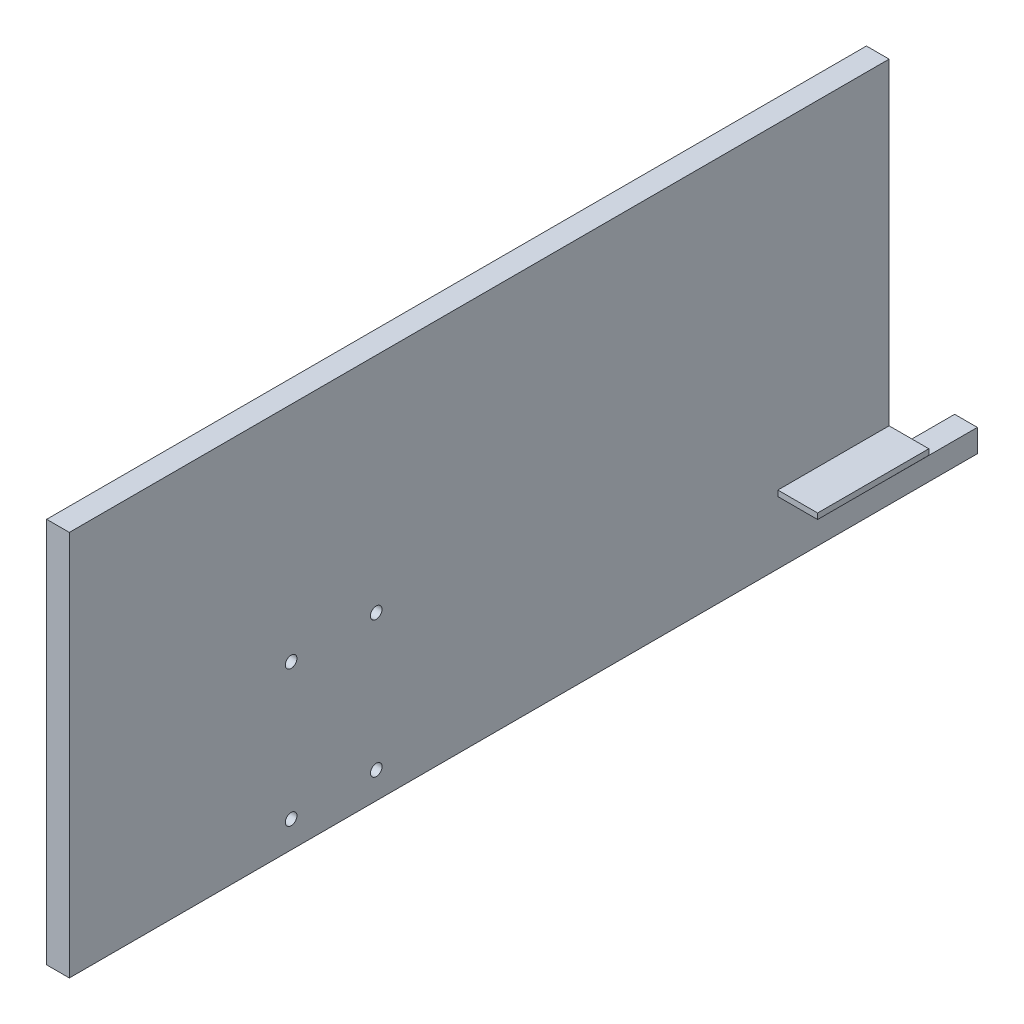
ISO-10303-21;
HEADER;
FILE_DESCRIPTION(('STEP AP214'),'2;1');
FILE_NAME('part.step','',(''),(''),'','','');
FILE_SCHEMA(('AUTOMOTIVE_DESIGN { 1 0 10303 214 1 1 1 1 }'));
ENDSEC;
DATA;
#1=APPLICATION_CONTEXT('core data for automotive mechanical design processes');
#2=APPLICATION_PROTOCOL_DEFINITION('international standard','automotive_design',2000,#1);
#3=PRODUCT_CONTEXT('',#1,'mechanical');
#4=PRODUCT('Part','Part','',(#3));
#5=PRODUCT_RELATED_PRODUCT_CATEGORY('part','',(#4));
#6=PRODUCT_DEFINITION_FORMATION('','',#4);
#7=PRODUCT_DEFINITION_CONTEXT('part definition',#1,'design');
#8=PRODUCT_DEFINITION('design','',#6,#7);
#9=PRODUCT_DEFINITION_SHAPE('','',#8);
#10=(LENGTH_UNIT() NAMED_UNIT(*) SI_UNIT(.MILLI.,.METRE.));
#11=(NAMED_UNIT(*) PLANE_ANGLE_UNIT() SI_UNIT($,.RADIAN.));
#12=(NAMED_UNIT(*) SI_UNIT($,.STERADIAN.) SOLID_ANGLE_UNIT());
#13=UNCERTAINTY_MEASURE_WITH_UNIT(LENGTH_MEASURE(1.E-05),#10,'distance_accuracy_value','');
#14=(GEOMETRIC_REPRESENTATION_CONTEXT(3) GLOBAL_UNCERTAINTY_ASSIGNED_CONTEXT((#13)) GLOBAL_UNIT_ASSIGNED_CONTEXT((#10,
#11,#12)) REPRESENTATION_CONTEXT('',''));
#15=CARTESIAN_POINT('',(0.,0.,0.));
#16=DIRECTION('',(0.,0.,1.));
#17=DIRECTION('',(1.,0.,0.));
#18=AXIS2_PLACEMENT_3D('',#15,#16,#17);
#19=CARTESIAN_POINT('',(10.,-170.,800.));
#20=DIRECTION('',(-1.,0.,0.));
#21=DIRECTION('',(0.,0.,1.));
#22=AXIS2_PLACEMENT_3D('',#19,#20,#21);
#23=PLANE('',#22);
#24=CARTESIAN_POINT('',(10.,-26.4213562373095,604.599389893775));
#25=DIRECTION('',(1.,0.,0.));
#26=DIRECTION('',(0.,0.,-1.));
#27=AXIS2_PLACEMENT_3D('',#24,#25,#26);
#28=CIRCLE('',#27,5.1);
#29=CARTESIAN_POINT('',(10.,-26.4213562373095,599.499389893775));
#30=VERTEX_POINT('',#29);
#31=EDGE_CURVE('E194',#30,#30,#28,.T.);
#32=ORIENTED_EDGE('',*,*,#31,.F.);
#33=EDGE_LOOP('',(#32));
#34=FACE_BOUND('',#33,.T.);
#35=CARTESIAN_POINT('',(10.,-146.42135623731,604.599389893775));
#36=DIRECTION('',(1.,0.,0.));
#37=DIRECTION('',(0.,0.,-1.));
#38=AXIS2_PLACEMENT_3D('',#35,#36,#37);
#39=CIRCLE('',#38,5.09999999999999);
#40=CARTESIAN_POINT('',(10.,-146.42135623731,599.499389893775));
#41=VERTEX_POINT('',#40);
#42=EDGE_CURVE('E188',#41,#41,#39,.T.);
#43=ORIENTED_EDGE('',*,*,#42,.F.);
#44=EDGE_LOOP('',(#43));
#45=FACE_BOUND('',#44,.T.);
#46=CARTESIAN_POINT('',(10.,-146.42135623731,529.599389893775));
#47=DIRECTION('',(1.,0.,0.));
#48=DIRECTION('',(0.,0.,-1.));
#49=AXIS2_PLACEMENT_3D('',#46,#47,#48);
#50=CIRCLE('',#49,5.09999999999999);
#51=CARTESIAN_POINT('',(10.,-146.42135623731,524.499389893775));
#52=VERTEX_POINT('',#51);
#53=EDGE_CURVE('E182',#52,#52,#50,.T.);
#54=ORIENTED_EDGE('',*,*,#53,.F.);
#55=EDGE_LOOP('',(#54));
#56=FACE_BOUND('',#55,.T.);
#57=CARTESIAN_POINT('',(10.,-26.4213562373095,529.599389893775));
#58=DIRECTION('',(1.,0.,0.));
#59=DIRECTION('',(0.,0.,-1.));
#60=AXIS2_PLACEMENT_3D('',#57,#58,#59);
#61=CIRCLE('',#60,5.1);
#62=CARTESIAN_POINT('',(10.,-26.4213562373095,524.499389893775));
#63=VERTEX_POINT('',#62);
#64=EDGE_CURVE('E171',#63,#63,#61,.T.);
#65=ORIENTED_EDGE('',*,*,#64,.F.);
#66=EDGE_LOOP('',(#65));
#67=FACE_BOUND('',#66,.T.);
#68=DIRECTION('',(0.,0.,-1.));
#69=VECTOR('',#68,1.);
#70=CARTESIAN_POINT('',(10.,-114.8,77.7500000000014));
#71=LINE('',#70,#69);
#72=CARTESIAN_POINT('',(10.,-114.8,175.750000000001));
#73=VERTEX_POINT('',#72);
#74=CARTESIAN_POINT('',(10.,-114.8,77.7500000000014));
#75=VERTEX_POINT('',#74);
#76=EDGE_CURVE('E57',#73,#75,#71,.T.);
#77=ORIENTED_EDGE('',*,*,#76,.F.);
#78=DIRECTION('',(0.,-1.,0.));
#79=VECTOR('',#78,1.);
#80=CARTESIAN_POINT('',(10.,-114.8,175.750000000001));
#81=LINE('',#80,#79);
#82=CARTESIAN_POINT('',(10.,-109.8,175.750000000001));
#83=VERTEX_POINT('',#82);
#84=EDGE_CURVE('E233',#83,#73,#81,.T.);
#85=ORIENTED_EDGE('',*,*,#84,.F.);
#86=DIRECTION('',(0.,0.,1.));
#87=VECTOR('',#86,1.);
#88=CARTESIAN_POINT('',(10.,-109.8,77.7500000000014));
#89=LINE('',#88,#87);
#90=CARTESIAN_POINT('',(10.,-109.8,77.7500000000014));
#91=VERTEX_POINT('',#90);
#92=EDGE_CURVE('E232',#91,#83,#89,.T.);
#93=ORIENTED_EDGE('',*,*,#92,.F.);
#94=DIRECTION('',(0.,-1.,0.));
#95=VECTOR('',#94,1.);
#96=CARTESIAN_POINT('',(10.,-149.875,77.7500000000014));
#97=LINE('',#96,#95);
#98=CARTESIAN_POINT('',(10.,170.,77.7500000000014));
#99=VERTEX_POINT('',#98);
#100=EDGE_CURVE('E153',#99,#91,#97,.T.);
#101=ORIENTED_EDGE('',*,*,#100,.F.);
#102=DIRECTION('',(0.,0.,-1.));
#103=VECTOR('',#102,1.);
#104=CARTESIAN_POINT('',(10.,170.,800.));
#105=LINE('',#104,#103);
#106=CARTESIAN_POINT('',(10.,170.,800.));
#107=VERTEX_POINT('',#106);
#108=EDGE_CURVE('E11',#107,#99,#105,.T.);
#109=ORIENTED_EDGE('',*,*,#108,.F.);
#110=DIRECTION('',(0.,1.,0.));
#111=VECTOR('',#110,1.);
#112=CARTESIAN_POINT('',(10.,-170.,800.));
#113=LINE('',#112,#111);
#114=CARTESIAN_POINT('',(10.,-170.,800.));
#115=VERTEX_POINT('',#114);
#116=EDGE_CURVE('E201',#115,#107,#113,.T.);
#117=ORIENTED_EDGE('',*,*,#116,.F.);
#118=DIRECTION('',(0.,0.,-1.));
#119=VECTOR('',#118,1.);
#120=CARTESIAN_POINT('',(10.,-170.,800.));
#121=LINE('',#120,#119);
#122=CARTESIAN_POINT('',(10.,-170.,0.));
#123=VERTEX_POINT('',#122);
#124=EDGE_CURVE('E211',#115,#123,#121,.T.);
#125=ORIENTED_EDGE('',*,*,#124,.T.);
#126=DIRECTION('',(0.,1.,0.));
#127=VECTOR('',#126,1.);
#128=CARTESIAN_POINT('',(10.,-170.,0.));
#129=LINE('',#128,#127);
#130=CARTESIAN_POINT('',(10.,-149.875,0.));
#131=VERTEX_POINT('',#130);
#132=EDGE_CURVE('E200',#123,#131,#129,.T.);
#133=ORIENTED_EDGE('',*,*,#132,.T.);
#134=DIRECTION('',(0.,0.,-1.));
#135=VECTOR('',#134,1.);
#136=CARTESIAN_POINT('',(10.,-149.875,77.7500000000014));
#137=LINE('',#136,#135);
#138=CARTESIAN_POINT('',(10.,-149.875,77.7500000000014));
#139=VERTEX_POINT('',#138);
#140=EDGE_CURVE('E164',#139,#131,#137,.T.);
#141=ORIENTED_EDGE('',*,*,#140,.F.);
#142=EDGE_CURVE('E62',#75,#139,#97,.T.);
#143=ORIENTED_EDGE('',*,*,#142,.F.);
#144=EDGE_LOOP('',(#77,#85,#93,#101,#109,#117,#125,#133,#141,#143));
#145=FACE_BOUND('',#144,.T.);
#146=ADVANCED_FACE('F43',(#34,#45,#56,#67,#145),#23,.F.);
#147=CARTESIAN_POINT('',(-10.,170.,800.));
#148=DIRECTION('',(0.,-1.,0.));
#149=DIRECTION('',(0.,0.,-1.));
#150=AXIS2_PLACEMENT_3D('',#147,#148,#149);
#151=PLANE('',#150);
#152=ORIENTED_EDGE('',*,*,#108,.T.);
#153=DIRECTION('',(1.,0.,0.));
#154=VECTOR('',#153,1.);
#155=CARTESIAN_POINT('',(-10.,170.,77.7500000000014));
#156=LINE('',#155,#154);
#157=CARTESIAN_POINT('',(-10.,170.,77.7500000000014));
#158=VERTEX_POINT('',#157);
#159=EDGE_CURVE('E169',#158,#99,#156,.T.);
#160=ORIENTED_EDGE('',*,*,#159,.F.);
#161=DIRECTION('',(0.,0.,-1.));
#162=VECTOR('',#161,1.);
#163=CARTESIAN_POINT('',(-10.,170.,800.));
#164=LINE('',#163,#162);
#165=CARTESIAN_POINT('',(-10.,170.,800.));
#166=VERTEX_POINT('',#165);
#167=EDGE_CURVE('E50',#166,#158,#164,.T.);
#168=ORIENTED_EDGE('',*,*,#167,.F.);
#169=DIRECTION('',(-1.,0.,0.));
#170=VECTOR('',#169,1.);
#171=CARTESIAN_POINT('',(-10.,170.,800.));
#172=LINE('',#171,#170);
#173=EDGE_CURVE('E204',#107,#166,#172,.T.);
#174=ORIENTED_EDGE('',*,*,#173,.F.);
#175=EDGE_LOOP('',(#152,#160,#168,#174));
#176=FACE_BOUND('',#175,.T.);
#177=ADVANCED_FACE('F229',(#176),#151,.F.);
#178=CARTESIAN_POINT('',(-10.,-170.,800.));
#179=DIRECTION('',(1.,0.,0.));
#180=DIRECTION('',(0.,0.,-1.));
#181=AXIS2_PLACEMENT_3D('',#178,#179,#180);
#182=PLANE('',#181);
#183=ORIENTED_EDGE('',*,*,#167,.T.);
#184=DIRECTION('',(0.,-1.,0.));
#185=VECTOR('',#184,1.);
#186=CARTESIAN_POINT('',(-10.,-149.875,77.7500000000014));
#187=LINE('',#186,#185);
#188=CARTESIAN_POINT('',(-10.,-149.875,77.7500000000014));
#189=VERTEX_POINT('',#188);
#190=EDGE_CURVE('E160',#158,#189,#187,.T.);
#191=ORIENTED_EDGE('',*,*,#190,.T.);
#192=DIRECTION('',(0.,0.,-1.));
#193=VECTOR('',#192,1.);
#194=CARTESIAN_POINT('',(-10.,-149.875,77.7500000000014));
#195=LINE('',#194,#193);
#196=CARTESIAN_POINT('',(-10.,-149.875,0.));
#197=VERTEX_POINT('',#196);
#198=EDGE_CURVE('E163',#189,#197,#195,.T.);
#199=ORIENTED_EDGE('',*,*,#198,.T.);
#200=DIRECTION('',(0.,-1.,0.));
#201=VECTOR('',#200,1.);
#202=CARTESIAN_POINT('',(-10.,-170.,0.));
#203=LINE('',#202,#201);
#204=CARTESIAN_POINT('',(-10.,-170.,0.));
#205=VERTEX_POINT('',#204);
#206=EDGE_CURVE('E214',#197,#205,#203,.T.);
#207=ORIENTED_EDGE('',*,*,#206,.T.);
#208=DIRECTION('',(0.,0.,-1.));
#209=VECTOR('',#208,1.);
#210=CARTESIAN_POINT('',(-10.,-170.,800.));
#211=LINE('',#210,#209);
#212=CARTESIAN_POINT('',(-10.,-170.,800.));
#213=VERTEX_POINT('',#212);
#214=EDGE_CURVE('E219',#213,#205,#211,.T.);
#215=ORIENTED_EDGE('',*,*,#214,.F.);
#216=DIRECTION('',(0.,-1.,0.));
#217=VECTOR('',#216,1.);
#218=CARTESIAN_POINT('',(-10.,-170.,800.));
#219=LINE('',#218,#217);
#220=EDGE_CURVE('E207',#166,#213,#219,.T.);
#221=ORIENTED_EDGE('',*,*,#220,.F.);
#222=EDGE_LOOP('',(#183,#191,#199,#207,#215,#221));
#223=FACE_BOUND('',#222,.T.);
#224=ADVANCED_FACE('F225',(#223),#182,.F.);
#225=CARTESIAN_POINT('',(-10.,-170.,800.));
#226=DIRECTION('',(0.,1.,0.));
#227=DIRECTION('',(0.,0.,1.));
#228=AXIS2_PLACEMENT_3D('',#225,#226,#227);
#229=PLANE('',#228);
#230=DIRECTION('',(1.,0.,0.));
#231=VECTOR('',#230,1.);
#232=CARTESIAN_POINT('',(-10.,-170.,0.));
#233=LINE('',#232,#231);
#234=EDGE_CURVE('E205',#205,#123,#233,.T.);
#235=ORIENTED_EDGE('',*,*,#234,.T.);
#236=ORIENTED_EDGE('',*,*,#124,.F.);
#237=DIRECTION('',(1.,0.,0.));
#238=VECTOR('',#237,1.);
#239=CARTESIAN_POINT('',(-10.,-170.,800.));
#240=LINE('',#239,#238);
#241=EDGE_CURVE('E209',#213,#115,#240,.T.);
#242=ORIENTED_EDGE('',*,*,#241,.F.);
#243=ORIENTED_EDGE('',*,*,#214,.T.);
#244=EDGE_LOOP('',(#235,#236,#242,#243));
#245=FACE_BOUND('',#244,.T.);
#246=ADVANCED_FACE('F313',(#245),#229,.F.);
#247=CARTESIAN_POINT('',(0.,0.,800.));
#248=DIRECTION('',(0.,0.,-1.));
#249=DIRECTION('',(-1.,0.,0.));
#250=AXIS2_PLACEMENT_3D('',#247,#248,#249);
#251=PLANE('',#250);
#252=ORIENTED_EDGE('',*,*,#116,.T.);
#253=ORIENTED_EDGE('',*,*,#173,.T.);
#254=ORIENTED_EDGE('',*,*,#220,.T.);
#255=ORIENTED_EDGE('',*,*,#241,.T.);
#256=EDGE_LOOP('',(#252,#253,#254,#255));
#257=FACE_BOUND('',#256,.T.);
#258=ADVANCED_FACE('F310',(#257),#251,.F.);
#259=CARTESIAN_POINT('',(0.,0.,0.));
#260=DIRECTION('',(0.,0.,-1.));
#261=DIRECTION('',(-1.,0.,0.));
#262=AXIS2_PLACEMENT_3D('',#259,#260,#261);
#263=PLANE('',#262);
#264=DIRECTION('',(1.,0.,0.));
#265=VECTOR('',#264,1.);
#266=CARTESIAN_POINT('',(-10.,-149.875,0.));
#267=LINE('',#266,#265);
#268=EDGE_CURVE('E172',#197,#131,#267,.T.);
#269=ORIENTED_EDGE('',*,*,#268,.T.);
#270=ORIENTED_EDGE('',*,*,#132,.F.);
#271=ORIENTED_EDGE('',*,*,#234,.F.);
#272=ORIENTED_EDGE('',*,*,#206,.F.);
#273=EDGE_LOOP('',(#269,#270,#271,#272));
#274=FACE_BOUND('',#273,.T.);
#275=ADVANCED_FACE('F308',(#274),#263,.T.);
#276=CARTESIAN_POINT('',(-1.93561084295944,-26.4213562373095,604.599389893775));
#277=DIRECTION('',(1.,0.,0.));
#278=DIRECTION('',(0.,0.,-1.));
#279=AXIS2_PLACEMENT_3D('',#276,#277,#278);
#280=CONICAL_SURFACE('',#279,5.09999999999999,1.02974425867665);
#281=CARTESIAN_POINT('',(-5.,-26.4213562373095,604.599389893775));
#282=VERTEX_POINT('',#281);
#283=VERTEX_LOOP('',#282);
#284=FACE_BOUND('',#283,.T.);
#285=CARTESIAN_POINT('',(-1.93561084295944,-26.4213562373095,604.599389893775));
#286=DIRECTION('',(1.,0.,0.));
#287=DIRECTION('',(0.,0.,-1.));
#288=AXIS2_PLACEMENT_3D('',#285,#286,#287);
#289=CIRCLE('',#288,5.09999999999999);
#290=CARTESIAN_POINT('',(-1.93561084295944,-26.4213562373095,599.499389893775));
#291=VERTEX_POINT('',#290);
#292=EDGE_CURVE('E197',#291,#291,#289,.T.);
#293=ORIENTED_EDGE('',*,*,#292,.T.);
#294=EDGE_LOOP('',(#293));
#295=FACE_BOUND('',#294,.T.);
#296=ADVANCED_FACE('F304',(#284,#295),#280,.F.);
#297=CARTESIAN_POINT('',(10.,-26.4213562373095,604.599389893775));
#298=DIRECTION('',(1.,0.,0.));
#299=DIRECTION('',(0.,0.,-1.));
#300=AXIS2_PLACEMENT_3D('',#297,#298,#299);
#301=CYLINDRICAL_SURFACE('',#300,5.1);
#302=ORIENTED_EDGE('',*,*,#292,.F.);
#303=EDGE_LOOP('',(#302));
#304=FACE_BOUND('',#303,.T.);
#305=ORIENTED_EDGE('',*,*,#31,.T.);
#306=EDGE_LOOP('',(#305));
#307=FACE_BOUND('',#306,.T.);
#308=ADVANCED_FACE('F300',(#304,#307),#301,.F.);
#309=CARTESIAN_POINT('',(-1.93561084295944,-146.42135623731,604.599389893775));
#310=DIRECTION('',(1.,0.,0.));
#311=DIRECTION('',(0.,0.,-1.));
#312=AXIS2_PLACEMENT_3D('',#309,#310,#311);
#313=CONICAL_SURFACE('',#312,5.09999999999999,1.02974425867665);
#314=CARTESIAN_POINT('',(-5.,-146.42135623731,604.599389893775));
#315=VERTEX_POINT('',#314);
#316=VERTEX_LOOP('',#315);
#317=FACE_BOUND('',#316,.T.);
#318=CARTESIAN_POINT('',(-1.93561084295944,-146.42135623731,604.599389893775));
#319=DIRECTION('',(1.,0.,0.));
#320=DIRECTION('',(0.,0.,-1.));
#321=AXIS2_PLACEMENT_3D('',#318,#319,#320);
#322=CIRCLE('',#321,5.09999999999999);
#323=CARTESIAN_POINT('',(-1.93561084295944,-146.42135623731,599.499389893775));
#324=VERTEX_POINT('',#323);
#325=EDGE_CURVE('E191',#324,#324,#322,.T.);
#326=ORIENTED_EDGE('',*,*,#325,.T.);
#327=EDGE_LOOP('',(#326));
#328=FACE_BOUND('',#327,.T.);
#329=ADVANCED_FACE('F296',(#317,#328),#313,.F.);
#330=CARTESIAN_POINT('',(10.,-146.42135623731,604.599389893775));
#331=DIRECTION('',(1.,0.,0.));
#332=DIRECTION('',(0.,0.,-1.));
#333=AXIS2_PLACEMENT_3D('',#330,#331,#332);
#334=CYLINDRICAL_SURFACE('',#333,5.09999999999999);
#335=ORIENTED_EDGE('',*,*,#325,.F.);
#336=EDGE_LOOP('',(#335));
#337=FACE_BOUND('',#336,.T.);
#338=ORIENTED_EDGE('',*,*,#42,.T.);
#339=EDGE_LOOP('',(#338));
#340=FACE_BOUND('',#339,.T.);
#341=ADVANCED_FACE('F292',(#337,#340),#334,.F.);
#342=CARTESIAN_POINT('',(-1.93561084295944,-146.42135623731,529.599389893775));
#343=DIRECTION('',(1.,0.,0.));
#344=DIRECTION('',(0.,0.,-1.));
#345=AXIS2_PLACEMENT_3D('',#342,#343,#344);
#346=CONICAL_SURFACE('',#345,5.09999999999999,1.02974425867665);
#347=CARTESIAN_POINT('',(-5.,-146.42135623731,529.599389893775));
#348=VERTEX_POINT('',#347);
#349=VERTEX_LOOP('',#348);
#350=FACE_BOUND('',#349,.T.);
#351=CARTESIAN_POINT('',(-1.93561084295944,-146.42135623731,529.599389893775));
#352=DIRECTION('',(1.,0.,0.));
#353=DIRECTION('',(0.,0.,-1.));
#354=AXIS2_PLACEMENT_3D('',#351,#352,#353);
#355=CIRCLE('',#354,5.09999999999999);
#356=CARTESIAN_POINT('',(-1.93561084295944,-146.42135623731,524.499389893775));
#357=VERTEX_POINT('',#356);
#358=EDGE_CURVE('E185',#357,#357,#355,.T.);
#359=ORIENTED_EDGE('',*,*,#358,.T.);
#360=EDGE_LOOP('',(#359));
#361=FACE_BOUND('',#360,.T.);
#362=ADVANCED_FACE('F288',(#350,#361),#346,.F.);
#363=CARTESIAN_POINT('',(10.,-146.42135623731,529.599389893775));
#364=DIRECTION('',(1.,0.,0.));
#365=DIRECTION('',(0.,0.,-1.));
#366=AXIS2_PLACEMENT_3D('',#363,#364,#365);
#367=CYLINDRICAL_SURFACE('',#366,5.09999999999999);
#368=ORIENTED_EDGE('',*,*,#358,.F.);
#369=EDGE_LOOP('',(#368));
#370=FACE_BOUND('',#369,.T.);
#371=ORIENTED_EDGE('',*,*,#53,.T.);
#372=EDGE_LOOP('',(#371));
#373=FACE_BOUND('',#372,.T.);
#374=ADVANCED_FACE('F281',(#370,#373),#367,.F.);
#375=CARTESIAN_POINT('',(-1.93561084295944,-26.4213562373095,529.599389893775));
#376=DIRECTION('',(1.,0.,0.));
#377=DIRECTION('',(0.,0.,-1.));
#378=AXIS2_PLACEMENT_3D('',#375,#376,#377);
#379=CONICAL_SURFACE('',#378,5.09999999999999,1.02974425867665);
#380=CARTESIAN_POINT('',(-5.,-26.4213562373095,529.599389893775));
#381=VERTEX_POINT('',#380);
#382=VERTEX_LOOP('',#381);
#383=FACE_BOUND('',#382,.T.);
#384=CARTESIAN_POINT('',(-1.93561084295944,-26.4213562373095,529.599389893775));
#385=DIRECTION('',(1.,0.,0.));
#386=DIRECTION('',(0.,0.,-1.));
#387=AXIS2_PLACEMENT_3D('',#384,#385,#386);
#388=CIRCLE('',#387,5.09999999999999);
#389=CARTESIAN_POINT('',(-1.93561084295944,-26.4213562373095,524.499389893775));
#390=VERTEX_POINT('',#389);
#391=EDGE_CURVE('E179',#390,#390,#388,.T.);
#392=ORIENTED_EDGE('',*,*,#391,.T.);
#393=EDGE_LOOP('',(#392));
#394=FACE_BOUND('',#393,.T.);
#395=ADVANCED_FACE('F273',(#383,#394),#379,.F.);
#396=CARTESIAN_POINT('',(10.,-26.4213562373095,529.599389893775));
#397=DIRECTION('',(1.,0.,0.));
#398=DIRECTION('',(0.,0.,-1.));
#399=AXIS2_PLACEMENT_3D('',#396,#397,#398);
#400=CYLINDRICAL_SURFACE('',#399,5.1);
#401=ORIENTED_EDGE('',*,*,#391,.F.);
#402=EDGE_LOOP('',(#401));
#403=FACE_BOUND('',#402,.T.);
#404=ORIENTED_EDGE('',*,*,#64,.T.);
#405=EDGE_LOOP('',(#404));
#406=FACE_BOUND('',#405,.T.);
#407=ADVANCED_FACE('F271',(#403,#406),#400,.F.);
#408=CARTESIAN_POINT('',(-10.,-149.875,77.7500000000014));
#409=DIRECTION('',(0.,0.,1.));
#410=DIRECTION('',(1.,0.,0.));
#411=AXIS2_PLACEMENT_3D('',#408,#409,#410);
#412=PLANE('',#411);
#413=ORIENTED_EDGE('',*,*,#100,.T.);
#414=DIRECTION('',(-1.,0.,0.));
#415=VECTOR('',#414,1.);
#416=CARTESIAN_POINT('',(45.,-109.8,77.7500000000014));
#417=LINE('',#416,#415);
#418=CARTESIAN_POINT('',(45.,-109.8,77.7500000000014));
#419=VERTEX_POINT('',#418);
#420=EDGE_CURVE('E134',#419,#91,#417,.T.);
#421=ORIENTED_EDGE('',*,*,#420,.F.);
#422=DIRECTION('',(0.,1.,0.));
#423=VECTOR('',#422,1.);
#424=CARTESIAN_POINT('',(45.,-114.8,77.7500000000014));
#425=LINE('',#424,#423);
#426=CARTESIAN_POINT('',(45.,-114.8,77.7500000000014));
#427=VERTEX_POINT('',#426);
#428=EDGE_CURVE('E140',#427,#419,#425,.T.);
#429=ORIENTED_EDGE('',*,*,#428,.F.);
#430=DIRECTION('',(-1.,0.,0.));
#431=VECTOR('',#430,1.);
#432=CARTESIAN_POINT('',(45.,-114.8,77.7500000000014));
#433=LINE('',#432,#431);
#434=EDGE_CURVE('E240',#427,#75,#433,.T.);
#435=ORIENTED_EDGE('',*,*,#434,.T.);
#436=ORIENTED_EDGE('',*,*,#142,.T.);
#437=DIRECTION('',(1.,0.,0.));
#438=VECTOR('',#437,1.);
#439=CARTESIAN_POINT('',(-10.,-149.875,77.7500000000014));
#440=LINE('',#439,#438);
#441=EDGE_CURVE('E166',#189,#139,#440,.T.);
#442=ORIENTED_EDGE('',*,*,#441,.F.);
#443=ORIENTED_EDGE('',*,*,#190,.F.);
#444=ORIENTED_EDGE('',*,*,#159,.T.);
#445=EDGE_LOOP('',(#413,#421,#429,#435,#436,#442,#443,#444));
#446=FACE_BOUND('',#445,.T.);
#447=ADVANCED_FACE('F151',(#446),#412,.F.);
#448=CARTESIAN_POINT('',(-10.,-149.875,77.7500000000014));
#449=DIRECTION('',(0.,-1.,0.));
#450=DIRECTION('',(0.,0.,-1.));
#451=AXIS2_PLACEMENT_3D('',#448,#449,#450);
#452=PLANE('',#451);
#453=ORIENTED_EDGE('',*,*,#140,.T.);
#454=ORIENTED_EDGE('',*,*,#268,.F.);
#455=ORIENTED_EDGE('',*,*,#198,.F.);
#456=ORIENTED_EDGE('',*,*,#441,.T.);
#457=EDGE_LOOP('',(#453,#454,#455,#456));
#458=FACE_BOUND('',#457,.T.);
#459=ADVANCED_FACE('F254',(#458),#452,.F.);
#460=CARTESIAN_POINT('',(45.,-109.8,77.7500000000014));
#461=DIRECTION('',(0.,-1.,0.));
#462=DIRECTION('',(0.,0.,-1.));
#463=AXIS2_PLACEMENT_3D('',#460,#461,#462);
#464=PLANE('',#463);
#465=ORIENTED_EDGE('',*,*,#92,.T.);
#466=DIRECTION('',(-1.,0.,0.));
#467=VECTOR('',#466,1.);
#468=CARTESIAN_POINT('',(45.,-109.8,175.750000000001));
#469=LINE('',#468,#467);
#470=CARTESIAN_POINT('',(45.,-109.8,175.750000000001));
#471=VERTEX_POINT('',#470);
#472=EDGE_CURVE('E136',#471,#83,#469,.T.);
#473=ORIENTED_EDGE('',*,*,#472,.F.);
#474=DIRECTION('',(0.,0.,1.));
#475=VECTOR('',#474,1.);
#476=CARTESIAN_POINT('',(45.,-109.8,77.7500000000014));
#477=LINE('',#476,#475);
#478=EDGE_CURVE('E129',#419,#471,#477,.T.);
#479=ORIENTED_EDGE('',*,*,#478,.F.);
#480=ORIENTED_EDGE('',*,*,#420,.T.);
#481=EDGE_LOOP('',(#465,#473,#479,#480));
#482=FACE_BOUND('',#481,.T.);
#483=ADVANCED_FACE('F132',(#482),#464,.F.);
#484=CARTESIAN_POINT('',(45.,-114.8,175.750000000001));
#485=DIRECTION('',(0.,0.,-1.));
#486=DIRECTION('',(-1.,0.,0.));
#487=AXIS2_PLACEMENT_3D('',#484,#485,#486);
#488=PLANE('',#487);
#489=ORIENTED_EDGE('',*,*,#84,.T.);
#490=DIRECTION('',(-1.,0.,0.));
#491=VECTOR('',#490,1.);
#492=CARTESIAN_POINT('',(45.,-114.8,175.750000000001));
#493=LINE('',#492,#491);
#494=CARTESIAN_POINT('',(45.,-114.8,175.750000000001));
#495=VERTEX_POINT('',#494);
#496=EDGE_CURVE('E156',#495,#73,#493,.T.);
#497=ORIENTED_EDGE('',*,*,#496,.F.);
#498=DIRECTION('',(0.,-1.,0.));
#499=VECTOR('',#498,1.);
#500=CARTESIAN_POINT('',(45.,-114.8,175.750000000001));
#501=LINE('',#500,#499);
#502=EDGE_CURVE('E139',#471,#495,#501,.T.);
#503=ORIENTED_EDGE('',*,*,#502,.F.);
#504=ORIENTED_EDGE('',*,*,#472,.T.);
#505=EDGE_LOOP('',(#489,#497,#503,#504));
#506=FACE_BOUND('',#505,.T.);
#507=ADVANCED_FACE('F246',(#506),#488,.F.);
#508=CARTESIAN_POINT('',(45.,-114.8,77.7500000000014));
#509=DIRECTION('',(0.,1.,0.));
#510=DIRECTION('',(0.,0.,1.));
#511=AXIS2_PLACEMENT_3D('',#508,#509,#510);
#512=PLANE('',#511);
#513=ORIENTED_EDGE('',*,*,#76,.T.);
#514=ORIENTED_EDGE('',*,*,#434,.F.);
#515=DIRECTION('',(0.,0.,-1.));
#516=VECTOR('',#515,1.);
#517=CARTESIAN_POINT('',(45.,-114.8,77.7500000000014));
#518=LINE('',#517,#516);
#519=EDGE_CURVE('E145',#495,#427,#518,.T.);
#520=ORIENTED_EDGE('',*,*,#519,.F.);
#521=ORIENTED_EDGE('',*,*,#496,.T.);
#522=EDGE_LOOP('',(#513,#514,#520,#521));
#523=FACE_BOUND('',#522,.T.);
#524=ADVANCED_FACE('F244',(#523),#512,.F.);
#525=CARTESIAN_POINT('',(45.,0.,0.));
#526=DIRECTION('',(1.,0.,0.));
#527=DIRECTION('',(0.,0.,-1.));
#528=AXIS2_PLACEMENT_3D('',#525,#526,#527);
#529=PLANE('',#528);
#530=ORIENTED_EDGE('',*,*,#428,.T.);
#531=ORIENTED_EDGE('',*,*,#478,.T.);
#532=ORIENTED_EDGE('',*,*,#502,.T.);
#533=ORIENTED_EDGE('',*,*,#519,.T.);
#534=EDGE_LOOP('',(#530,#531,#532,#533));
#535=FACE_BOUND('',#534,.T.);
#536=ADVANCED_FACE('F143',(#535),#529,.T.);
#537=CLOSED_SHELL('',(#146,#177,#224,#246,#258,#275,#296,#308,#329,#341,#362,#374,#395,#407,
#447,#459,#483,#507,#524,#536));
#538=MANIFOLD_SOLID_BREP('B2',#537);
#539=ADVANCED_BREP_SHAPE_REPRESENTATION('',(#18,#538),#14);
#540=SHAPE_DEFINITION_REPRESENTATION(#9,#539);
ENDSEC;
END-ISO-10303-21;
